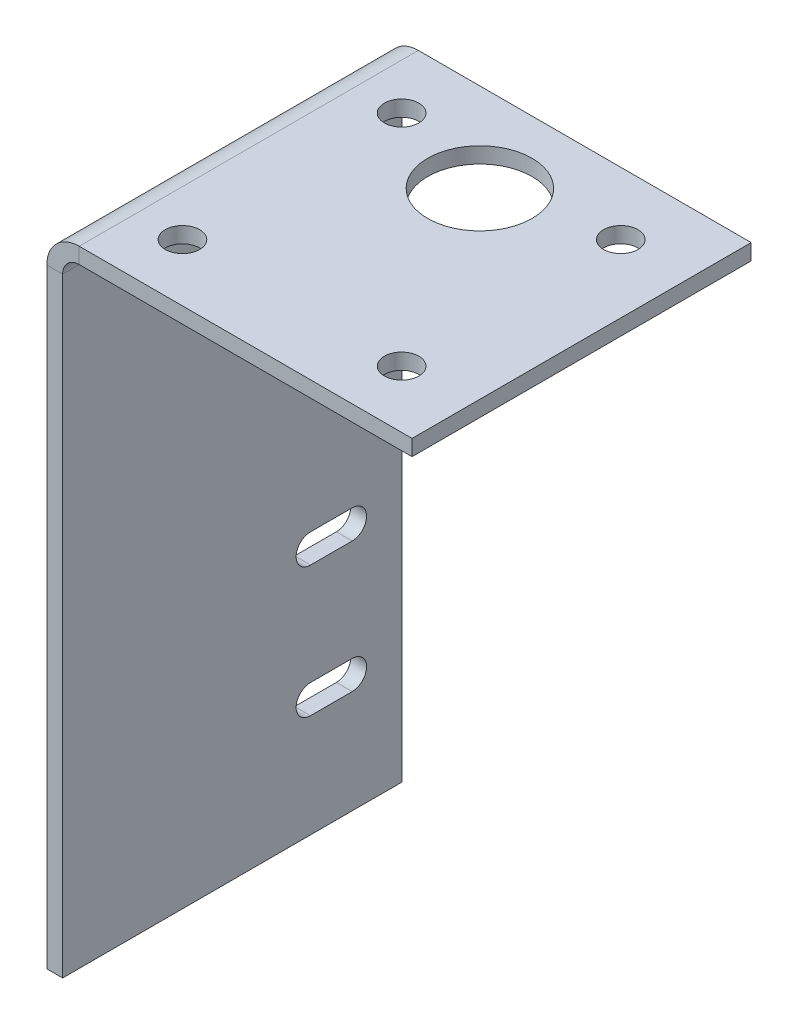
ISO-10303-21;
HEADER;
FILE_DESCRIPTION(('STEP AP214'),'2;1');
FILE_NAME('part.step','',(''),(''),'','','');
FILE_SCHEMA(('AUTOMOTIVE_DESIGN { 1 0 10303 214 1 1 1 1 }'));
ENDSEC;
DATA;
#1=APPLICATION_CONTEXT('core data for automotive mechanical design processes');
#2=APPLICATION_PROTOCOL_DEFINITION('international standard','automotive_design',2000,#1);
#3=PRODUCT_CONTEXT('',#1,'mechanical');
#4=PRODUCT('Part','Part','',(#3));
#5=PRODUCT_RELATED_PRODUCT_CATEGORY('part','',(#4));
#6=PRODUCT_DEFINITION_FORMATION('','',#4);
#7=PRODUCT_DEFINITION_CONTEXT('part definition',#1,'design');
#8=PRODUCT_DEFINITION('design','',#6,#7);
#9=PRODUCT_DEFINITION_SHAPE('','',#8);
#10=(LENGTH_UNIT() NAMED_UNIT(*) SI_UNIT(.MILLI.,.METRE.));
#11=(NAMED_UNIT(*) PLANE_ANGLE_UNIT() SI_UNIT($,.RADIAN.));
#12=(NAMED_UNIT(*) SI_UNIT($,.STERADIAN.) SOLID_ANGLE_UNIT());
#13=UNCERTAINTY_MEASURE_WITH_UNIT(LENGTH_MEASURE(1.E-05),#10,'distance_accuracy_value','');
#14=(GEOMETRIC_REPRESENTATION_CONTEXT(3) GLOBAL_UNCERTAINTY_ASSIGNED_CONTEXT((#13)) GLOBAL_UNIT_ASSIGNED_CONTEXT((#10,
#11,#12)) REPRESENTATION_CONTEXT('',''));
#15=CARTESIAN_POINT('',(0.,0.,0.));
#16=DIRECTION('',(0.,0.,1.));
#17=DIRECTION('',(1.,0.,0.));
#18=AXIS2_PLACEMENT_3D('',#15,#16,#17);
#19=CARTESIAN_POINT('',(0.,-3.03784,-32.5));
#20=DIRECTION('',(0.,0.,-1.));
#21=DIRECTION('',(-1.,0.,0.));
#22=AXIS2_PLACEMENT_3D('',#19,#20,#21);
#23=PLANE('',#22);
#24=DIRECTION('',(-1.,0.,0.));
#25=VECTOR('',#24,1.);
#26=CARTESIAN_POINT('',(0.,-3.03784,-32.5));
#27=LINE('',#26,#25);
#28=CARTESIAN_POINT('',(70.,-3.03784,-32.5));
#29=VERTEX_POINT('',#28);
#30=CARTESIAN_POINT('',(6.21283999999999,-3.03784,-32.5));
#31=VERTEX_POINT('',#30);
#32=EDGE_CURVE('E278',#29,#31,#27,.T.);
#33=ORIENTED_EDGE('',*,*,#32,.T.);
#34=DIRECTION('',(0.,1.,0.));
#35=VECTOR('',#34,1.);
#36=CARTESIAN_POINT('',(6.21283999999999,-3.03784,-32.5));
#37=LINE('',#36,#35);
#38=CARTESIAN_POINT('',(6.21284,0.,-32.5));
#39=VERTEX_POINT('',#38);
#40=EDGE_CURVE('E256',#31,#39,#37,.T.);
#41=ORIENTED_EDGE('',*,*,#40,.T.);
#42=DIRECTION('',(-1.,0.,0.));
#43=VECTOR('',#42,1.);
#44=CARTESIAN_POINT('',(0.,0.,-32.5));
#45=LINE('',#44,#43);
#46=CARTESIAN_POINT('',(70.,0.,-32.5));
#47=VERTEX_POINT('',#46);
#48=EDGE_CURVE('E275',#47,#39,#45,.T.);
#49=ORIENTED_EDGE('',*,*,#48,.F.);
#50=DIRECTION('',(0.,1.,0.));
#51=VECTOR('',#50,1.);
#52=CARTESIAN_POINT('',(70.,-3.03784,-32.5));
#53=LINE('',#52,#51);
#54=EDGE_CURVE('E288',#29,#47,#53,.T.);
#55=ORIENTED_EDGE('',*,*,#54,.F.);
#56=EDGE_LOOP('',(#33,#41,#49,#55));
#57=FACE_BOUND('',#56,.T.);
#58=ADVANCED_FACE('F58',(#57),#23,.T.);
#59=CARTESIAN_POINT('',(0.,-3.03784,0.));
#60=DIRECTION('',(0.,1.,0.));
#61=DIRECTION('',(0.,0.,1.));
#62=AXIS2_PLACEMENT_3D('',#59,#60,#61);
#63=PLANE('',#62);
#64=CARTESIAN_POINT('',(35.,-3.03784,-15.5));
#65=DIRECTION('',(0.,-1.,0.));
#66=DIRECTION('',(0.,0.,-1.));
#67=AXIS2_PLACEMENT_3D('',#64,#65,#66);
#68=CIRCLE('',#67,10.);
#69=CARTESIAN_POINT('',(35.,-3.03784,-25.5));
#70=VERTEX_POINT('',#69);
#71=EDGE_CURVE('E338',#70,#70,#68,.T.);
#72=ORIENTED_EDGE('',*,*,#71,.F.);
#73=EDGE_LOOP('',(#72));
#74=FACE_BOUND('',#73,.T.);
#75=CARTESIAN_POINT('',(57.,-3.03784,-20.5));
#76=DIRECTION('',(0.,1.,0.));
#77=DIRECTION('',(0.,0.,1.));
#78=AXIS2_PLACEMENT_3D('',#75,#76,#77);
#79=CIRCLE('',#78,3.29999999999998);
#80=CARTESIAN_POINT('',(57.,-3.03784,-17.2));
#81=VERTEX_POINT('',#80);
#82=EDGE_CURVE('E331',#81,#81,#79,.T.);
#83=ORIENTED_EDGE('',*,*,#82,.T.);
#84=EDGE_LOOP('',(#83));
#85=FACE_BOUND('',#84,.T.);
#86=CARTESIAN_POINT('',(57.,-3.03784,21.5));
#87=DIRECTION('',(0.,1.,0.));
#88=DIRECTION('',(0.,0.,1.));
#89=AXIS2_PLACEMENT_3D('',#86,#87,#88);
#90=CIRCLE('',#89,3.29999999999998);
#91=CARTESIAN_POINT('',(57.,-3.03784,24.8));
#92=VERTEX_POINT('',#91);
#93=EDGE_CURVE('E325',#92,#92,#90,.T.);
#94=ORIENTED_EDGE('',*,*,#93,.T.);
#95=EDGE_LOOP('',(#94));
#96=FACE_BOUND('',#95,.T.);
#97=CARTESIAN_POINT('',(15.,-3.03784,21.5));
#98=DIRECTION('',(0.,1.,0.));
#99=DIRECTION('',(0.,0.,1.));
#100=AXIS2_PLACEMENT_3D('',#97,#98,#99);
#101=CIRCLE('',#100,3.29999999999998);
#102=CARTESIAN_POINT('',(15.,-3.03784,24.8));
#103=VERTEX_POINT('',#102);
#104=EDGE_CURVE('E319',#103,#103,#101,.T.);
#105=ORIENTED_EDGE('',*,*,#104,.T.);
#106=EDGE_LOOP('',(#105));
#107=FACE_BOUND('',#106,.T.);
#108=CARTESIAN_POINT('',(15.,-3.03784,-20.5));
#109=DIRECTION('',(0.,1.,0.));
#110=DIRECTION('',(0.,0.,1.));
#111=AXIS2_PLACEMENT_3D('',#108,#109,#110);
#112=CIRCLE('',#111,3.29999999999998);
#113=CARTESIAN_POINT('',(15.,-3.03784,-17.2));
#114=VERTEX_POINT('',#113);
#115=EDGE_CURVE('E312',#114,#114,#112,.T.);
#116=ORIENTED_EDGE('',*,*,#115,.T.);
#117=EDGE_LOOP('',(#116));
#118=FACE_BOUND('',#117,.T.);
#119=DIRECTION('',(0.,0.,-1.));
#120=VECTOR('',#119,1.);
#121=CARTESIAN_POINT('',(6.21283999999999,-3.03784,-32.5));
#122=LINE('',#121,#120);
#123=CARTESIAN_POINT('',(6.21283999999999,-3.03784,32.5));
#124=VERTEX_POINT('',#123);
#125=EDGE_CURVE('E262',#31,#124,#122,.F.);
#126=ORIENTED_EDGE('',*,*,#125,.F.);
#127=ORIENTED_EDGE('',*,*,#32,.F.);
#128=DIRECTION('',(0.,0.,-1.));
#129=VECTOR('',#128,1.);
#130=CARTESIAN_POINT('',(70.,-3.03784,-32.5));
#131=LINE('',#130,#129);
#132=CARTESIAN_POINT('',(70.,-3.03784,32.5));
#133=VERTEX_POINT('',#132);
#134=EDGE_CURVE('E274',#133,#29,#131,.T.);
#135=ORIENTED_EDGE('',*,*,#134,.F.);
#136=DIRECTION('',(1.,0.,0.));
#137=VECTOR('',#136,1.);
#138=CARTESIAN_POINT('',(0.,-3.03784,32.5));
#139=LINE('',#138,#137);
#140=EDGE_CURVE('E272',#124,#133,#139,.T.);
#141=ORIENTED_EDGE('',*,*,#140,.F.);
#142=EDGE_LOOP('',(#126,#127,#135,#141));
#143=FACE_BOUND('',#142,.T.);
#144=ADVANCED_FACE('F354',(#74,#85,#96,#107,#118,#143),#63,.F.);
#145=CARTESIAN_POINT('',(0.,0.,0.));
#146=DIRECTION('',(0.,1.,0.));
#147=DIRECTION('',(0.,0.,1.));
#148=AXIS2_PLACEMENT_3D('',#145,#146,#147);
#149=PLANE('',#148);
#150=CARTESIAN_POINT('',(35.,0.,-15.5));
#151=DIRECTION('',(0.,-1.,0.));
#152=DIRECTION('',(0.,0.,-1.));
#153=AXIS2_PLACEMENT_3D('',#150,#151,#152);
#154=CIRCLE('',#153,10.);
#155=CARTESIAN_POINT('',(35.,0.,-25.5));
#156=VERTEX_POINT('',#155);
#157=EDGE_CURVE('E337',#156,#156,#154,.T.);
#158=ORIENTED_EDGE('',*,*,#157,.T.);
#159=EDGE_LOOP('',(#158));
#160=FACE_BOUND('',#159,.T.);
#161=CARTESIAN_POINT('',(57.,0.,-20.5));
#162=DIRECTION('',(0.,1.,0.));
#163=DIRECTION('',(0.,0.,1.));
#164=AXIS2_PLACEMENT_3D('',#161,#162,#163);
#165=CIRCLE('',#164,3.29999999999998);
#166=CARTESIAN_POINT('',(57.,0.,-17.2));
#167=VERTEX_POINT('',#166);
#168=EDGE_CURVE('E334',#167,#167,#165,.T.);
#169=ORIENTED_EDGE('',*,*,#168,.F.);
#170=EDGE_LOOP('',(#169));
#171=FACE_BOUND('',#170,.T.);
#172=CARTESIAN_POINT('',(57.,0.,21.5));
#173=DIRECTION('',(0.,1.,0.));
#174=DIRECTION('',(0.,0.,1.));
#175=AXIS2_PLACEMENT_3D('',#172,#173,#174);
#176=CIRCLE('',#175,3.29999999999999);
#177=CARTESIAN_POINT('',(57.,0.,24.8));
#178=VERTEX_POINT('',#177);
#179=EDGE_CURVE('E328',#178,#178,#176,.T.);
#180=ORIENTED_EDGE('',*,*,#179,.F.);
#181=EDGE_LOOP('',(#180));
#182=FACE_BOUND('',#181,.T.);
#183=CARTESIAN_POINT('',(15.,0.,21.5));
#184=DIRECTION('',(0.,1.,0.));
#185=DIRECTION('',(0.,0.,1.));
#186=AXIS2_PLACEMENT_3D('',#183,#184,#185);
#187=CIRCLE('',#186,3.29999999999999);
#188=CARTESIAN_POINT('',(15.,0.,24.8));
#189=VERTEX_POINT('',#188);
#190=EDGE_CURVE('E322',#189,#189,#187,.T.);
#191=ORIENTED_EDGE('',*,*,#190,.F.);
#192=EDGE_LOOP('',(#191));
#193=FACE_BOUND('',#192,.T.);
#194=CARTESIAN_POINT('',(15.,0.,-20.5));
#195=DIRECTION('',(0.,1.,0.));
#196=DIRECTION('',(0.,0.,1.));
#197=AXIS2_PLACEMENT_3D('',#194,#195,#196);
#198=CIRCLE('',#197,3.29999999999999);
#199=CARTESIAN_POINT('',(15.,0.,-17.2));
#200=VERTEX_POINT('',#199);
#201=EDGE_CURVE('E314',#200,#200,#198,.T.);
#202=ORIENTED_EDGE('',*,*,#201,.F.);
#203=EDGE_LOOP('',(#202));
#204=FACE_BOUND('',#203,.T.);
#205=ORIENTED_EDGE('',*,*,#48,.T.);
#206=DIRECTION('',(0.,0.,-1.));
#207=VECTOR('',#206,1.);
#208=CARTESIAN_POINT('',(6.21284,0.,-32.5));
#209=LINE('',#208,#207);
#210=CARTESIAN_POINT('',(6.21283999999999,0.,32.5));
#211=VERTEX_POINT('',#210);
#212=EDGE_CURVE('E249',#39,#211,#209,.F.);
#213=ORIENTED_EDGE('',*,*,#212,.T.);
#214=DIRECTION('',(1.,0.,0.));
#215=VECTOR('',#214,1.);
#216=CARTESIAN_POINT('',(0.,0.,32.5));
#217=LINE('',#216,#215);
#218=CARTESIAN_POINT('',(70.,0.,32.5));
#219=VERTEX_POINT('',#218);
#220=EDGE_CURVE('E269',#211,#219,#217,.T.);
#221=ORIENTED_EDGE('',*,*,#220,.T.);
#222=DIRECTION('',(0.,0.,-1.));
#223=VECTOR('',#222,1.);
#224=CARTESIAN_POINT('',(70.,0.,-32.5));
#225=LINE('',#224,#223);
#226=EDGE_CURVE('E283',#219,#47,#225,.T.);
#227=ORIENTED_EDGE('',*,*,#226,.T.);
#228=EDGE_LOOP('',(#205,#213,#221,#227));
#229=FACE_BOUND('',#228,.T.);
#230=ADVANCED_FACE('F344',(#160,#171,#182,#193,#204,#229),#149,.T.);
#231=CARTESIAN_POINT('',(70.,-3.03784,-32.5));
#232=DIRECTION('',(1.,0.,0.));
#233=DIRECTION('',(0.,0.,-1.));
#234=AXIS2_PLACEMENT_3D('',#231,#232,#233);
#235=PLANE('',#234);
#236=ORIENTED_EDGE('',*,*,#226,.F.);
#237=DIRECTION('',(0.,1.,0.));
#238=VECTOR('',#237,1.);
#239=CARTESIAN_POINT('',(70.,-3.03784,32.5));
#240=LINE('',#239,#238);
#241=EDGE_CURVE('E281',#133,#219,#240,.T.);
#242=ORIENTED_EDGE('',*,*,#241,.F.);
#243=ORIENTED_EDGE('',*,*,#134,.T.);
#244=ORIENTED_EDGE('',*,*,#54,.T.);
#245=EDGE_LOOP('',(#236,#242,#243,#244));
#246=FACE_BOUND('',#245,.T.);
#247=ADVANCED_FACE('F377',(#246),#235,.T.);
#248=CARTESIAN_POINT('',(0.,-3.03784,32.5));
#249=DIRECTION('',(0.,0.,1.));
#250=DIRECTION('',(1.,0.,0.));
#251=AXIS2_PLACEMENT_3D('',#248,#249,#250);
#252=PLANE('',#251);
#253=DIRECTION('',(0.,1.,0.));
#254=VECTOR('',#253,1.);
#255=CARTESIAN_POINT('',(6.21283999999999,-3.03784,32.5));
#256=LINE('',#255,#254);
#257=EDGE_CURVE('E266',#124,#211,#256,.T.);
#258=ORIENTED_EDGE('',*,*,#257,.F.);
#259=ORIENTED_EDGE('',*,*,#140,.T.);
#260=ORIENTED_EDGE('',*,*,#241,.T.);
#261=ORIENTED_EDGE('',*,*,#220,.F.);
#262=EDGE_LOOP('',(#258,#259,#260,#261));
#263=FACE_BOUND('',#262,.T.);
#264=ADVANCED_FACE('F60',(#263),#252,.T.);
#265=CARTESIAN_POINT('',(6.21283999999999,-6.21284,32.5));
#266=DIRECTION('',(0.,0.,1.));
#267=DIRECTION('',(1.,0.,0.));
#268=AXIS2_PLACEMENT_3D('',#265,#266,#267);
#269=PLANE('',#268);
#270=DIRECTION('',(1.,0.,0.));
#271=VECTOR('',#270,1.);
#272=CARTESIAN_POINT('',(0.,-6.21283999999998,32.5));
#273=LINE('',#272,#271);
#274=CARTESIAN_POINT('',(3.03783999999999,-6.21283999999999,32.5));
#275=VERTEX_POINT('',#274);
#276=CARTESIAN_POINT('',(0.,-6.21283999999998,32.4999999999999));
#277=VERTEX_POINT('',#276);
#278=EDGE_CURVE('E212',#275,#277,#273,.F.);
#279=ORIENTED_EDGE('',*,*,#278,.F.);
#280=CARTESIAN_POINT('',(6.21283999999999,-6.21284,32.5));
#281=DIRECTION('',(0.,0.,-1.));
#282=DIRECTION('',(-1.,0.,0.));
#283=AXIS2_PLACEMENT_3D('',#280,#281,#282);
#284=CIRCLE('',#283,3.175);
#285=EDGE_CURVE('E259',#124,#275,#284,.F.);
#286=ORIENTED_EDGE('',*,*,#285,.F.);
#287=ORIENTED_EDGE('',*,*,#257,.T.);
#288=CARTESIAN_POINT('',(6.21283999999999,-6.21284,32.4999999999999));
#289=DIRECTION('',(0.,0.,-1.));
#290=DIRECTION('',(-1.,0.,0.));
#291=AXIS2_PLACEMENT_3D('',#288,#289,#290);
#292=CIRCLE('',#291,6.21284);
#293=EDGE_CURVE('E252',#211,#277,#292,.F.);
#294=ORIENTED_EDGE('',*,*,#293,.T.);
#295=EDGE_LOOP('',(#279,#286,#287,#294));
#296=FACE_BOUND('',#295,.T.);
#297=ADVANCED_FACE('F382',(#296),#269,.T.);
#298=CARTESIAN_POINT('',(6.21283999999999,-6.21284,-32.5));
#299=DIRECTION('',(0.,0.,1.));
#300=DIRECTION('',(1.,0.,0.));
#301=AXIS2_PLACEMENT_3D('',#298,#299,#300);
#302=PLANE('',#301);
#303=CARTESIAN_POINT('',(6.21283999999999,-6.21284,-32.5));
#304=DIRECTION('',(0.,0.,-1.));
#305=DIRECTION('',(-1.,0.,0.));
#306=AXIS2_PLACEMENT_3D('',#303,#304,#305);
#307=CIRCLE('',#306,3.175);
#308=CARTESIAN_POINT('',(3.03783999999999,-6.21283999999999,-32.5));
#309=VERTEX_POINT('',#308);
#310=EDGE_CURVE('E222',#309,#31,#307,.T.);
#311=ORIENTED_EDGE('',*,*,#310,.F.);
#312=DIRECTION('',(1.,0.,0.));
#313=VECTOR('',#312,1.);
#314=CARTESIAN_POINT('',(3.03783999999999,-6.21283999999999,-32.5));
#315=LINE('',#314,#313);
#316=CARTESIAN_POINT('',(0.,-6.21283999999998,-32.5));
#317=VERTEX_POINT('',#316);
#318=EDGE_CURVE('E242',#309,#317,#315,.F.);
#319=ORIENTED_EDGE('',*,*,#318,.T.);
#320=CARTESIAN_POINT('',(6.21283999999999,-6.21284,-32.5));
#321=DIRECTION('',(0.,0.,-1.));
#322=DIRECTION('',(-1.,0.,0.));
#323=AXIS2_PLACEMENT_3D('',#320,#321,#322);
#324=CIRCLE('',#323,6.21284);
#325=EDGE_CURVE('E253',#317,#39,#324,.T.);
#326=ORIENTED_EDGE('',*,*,#325,.T.);
#327=ORIENTED_EDGE('',*,*,#40,.F.);
#328=EDGE_LOOP('',(#311,#319,#326,#327));
#329=FACE_BOUND('',#328,.T.);
#330=ADVANCED_FACE('F388',(#329),#302,.F.);
#331=CARTESIAN_POINT('',(6.21283999999999,-6.21284,-32.5));
#332=DIRECTION('',(0.,0.,-1.));
#333=DIRECTION('',(-1.,0.,0.));
#334=AXIS2_PLACEMENT_3D('',#331,#332,#333);
#335=CYLINDRICAL_SURFACE('',#334,6.21284);
#336=ORIENTED_EDGE('',*,*,#212,.F.);
#337=ORIENTED_EDGE('',*,*,#325,.F.);
#338=DIRECTION('',(0.,0.,-1.));
#339=VECTOR('',#338,1.);
#340=CARTESIAN_POINT('',(0.,-6.21283999999998,32.5));
#341=LINE('',#340,#339);
#342=EDGE_CURVE('E240',#317,#277,#341,.F.);
#343=ORIENTED_EDGE('',*,*,#342,.T.);
#344=ORIENTED_EDGE('',*,*,#293,.F.);
#345=EDGE_LOOP('',(#336,#337,#343,#344));
#346=FACE_BOUND('',#345,.T.);
#347=ADVANCED_FACE('F385',(#346),#335,.T.);
#348=CARTESIAN_POINT('',(6.21283999999999,-6.21284,-32.5));
#349=DIRECTION('',(0.,0.,-1.));
#350=DIRECTION('',(-1.,0.,0.));
#351=AXIS2_PLACEMENT_3D('',#348,#349,#350);
#352=CYLINDRICAL_SURFACE('',#351,3.175);
#353=ORIENTED_EDGE('',*,*,#125,.T.);
#354=ORIENTED_EDGE('',*,*,#285,.T.);
#355=DIRECTION('',(0.,0.,-1.));
#356=VECTOR('',#355,1.);
#357=CARTESIAN_POINT('',(3.03783999999999,-6.21283999999999,32.5));
#358=LINE('',#357,#356);
#359=EDGE_CURVE('E245',#275,#309,#358,.T.);
#360=ORIENTED_EDGE('',*,*,#359,.T.);
#361=ORIENTED_EDGE('',*,*,#310,.T.);
#362=EDGE_LOOP('',(#353,#354,#360,#361));
#363=FACE_BOUND('',#362,.T.);
#364=ADVANCED_FACE('F407',(#363),#352,.F.);
#365=CARTESIAN_POINT('',(-4.13297868151474E-13,-123.03784,-32.5));
#366=DIRECTION('',(0.,0.,1.));
#367=DIRECTION('',(1.,0.,0.));
#368=AXIS2_PLACEMENT_3D('',#365,#366,#367);
#369=PLANE('',#368);
#370=ORIENTED_EDGE('',*,*,#318,.F.);
#371=DIRECTION('',(0.,1.,0.));
#372=VECTOR('',#371,1.);
#373=CARTESIAN_POINT('',(3.03783999999959,-123.03784,-32.5));
#374=LINE('',#373,#372);
#375=CARTESIAN_POINT('',(3.03783999999959,-123.03784,-32.5));
#376=VERTEX_POINT('',#375);
#377=EDGE_CURVE('E238',#309,#376,#374,.F.);
#378=ORIENTED_EDGE('',*,*,#377,.T.);
#379=DIRECTION('',(1.,0.,0.));
#380=VECTOR('',#379,1.);
#381=CARTESIAN_POINT('',(-4.13297868151474E-13,-123.03784,-32.5));
#382=LINE('',#381,#380);
#383=CARTESIAN_POINT('',(-4.13538130178782E-13,-123.03784,-32.5));
#384=VERTEX_POINT('',#383);
#385=EDGE_CURVE('E219',#384,#376,#382,.T.);
#386=ORIENTED_EDGE('',*,*,#385,.F.);
#387=DIRECTION('',(0.,-1.,0.));
#388=VECTOR('',#387,1.);
#389=CARTESIAN_POINT('',(0.,0.,-32.5));
#390=LINE('',#389,#388);
#391=EDGE_CURVE('E231',#317,#384,#390,.T.);
#392=ORIENTED_EDGE('',*,*,#391,.F.);
#393=EDGE_LOOP('',(#370,#378,#386,#392));
#394=FACE_BOUND('',#393,.T.);
#395=ADVANCED_FACE('F398',(#394),#369,.F.);
#396=CARTESIAN_POINT('',(0.,-3.03783999999999,32.5));
#397=DIRECTION('',(0.,0.,-1.));
#398=DIRECTION('',(-1.,0.,0.));
#399=AXIS2_PLACEMENT_3D('',#396,#397,#398);
#400=PLANE('',#399);
#401=ORIENTED_EDGE('',*,*,#278,.T.);
#402=DIRECTION('',(0.,1.,0.));
#403=VECTOR('',#402,1.);
#404=CARTESIAN_POINT('',(0.,0.,32.5));
#405=LINE('',#404,#403);
#406=CARTESIAN_POINT('',(-4.13538130178782E-13,-123.03784,32.5));
#407=VERTEX_POINT('',#406);
#408=EDGE_CURVE('E226',#407,#277,#405,.T.);
#409=ORIENTED_EDGE('',*,*,#408,.F.);
#410=DIRECTION('',(1.,0.,0.));
#411=VECTOR('',#410,1.);
#412=CARTESIAN_POINT('',(-4.13339909364251E-13,-123.03784,32.5));
#413=LINE('',#412,#411);
#414=CARTESIAN_POINT('',(3.03783999999959,-123.03784,32.5));
#415=VERTEX_POINT('',#414);
#416=EDGE_CURVE('E223',#407,#415,#413,.T.);
#417=ORIENTED_EDGE('',*,*,#416,.T.);
#418=DIRECTION('',(0.,-1.,0.));
#419=VECTOR('',#418,1.);
#420=CARTESIAN_POINT('',(3.03784000000001,-3.03784,32.5));
#421=LINE('',#420,#419);
#422=EDGE_CURVE('E233',#415,#275,#421,.F.);
#423=ORIENTED_EDGE('',*,*,#422,.T.);
#424=EDGE_LOOP('',(#401,#409,#417,#423));
#425=FACE_BOUND('',#424,.T.);
#426=ADVANCED_FACE('F405',(#425),#400,.F.);
#427=CARTESIAN_POINT('',(0.,0.,0.));
#428=DIRECTION('',(1.,0.,0.));
#429=DIRECTION('',(0.,1.,0.));
#430=AXIS2_PLACEMENT_3D('',#427,#428,#429);
#431=PLANE('',#430);
#432=DIRECTION('',(0.,0.,1.));
#433=VECTOR('',#432,1.);
#434=CARTESIAN_POINT('',(-3.60495448235553E-13,-103.25,-23.));
#435=LINE('',#434,#433);
#436=CARTESIAN_POINT('',(-3.44449256082768E-13,-103.25,-23.));
#437=VERTEX_POINT('',#436);
#438=CARTESIAN_POINT('',(-3.60495448235553E-13,-103.25,-15.));
#439=VERTEX_POINT('',#438);
#440=EDGE_CURVE('E182',#437,#439,#435,.T.);
#441=ORIENTED_EDGE('',*,*,#440,.F.);
#442=CARTESIAN_POINT('',(-3.50893874553735E-13,-100.5,-23.));
#443=DIRECTION('',(-1.,0.,0.));
#444=DIRECTION('',(0.,-1.,0.));
#445=AXIS2_PLACEMENT_3D('',#442,#443,#444);
#446=CIRCLE('',#445,2.74999999999999);
#447=CARTESIAN_POINT('',(-3.41292300871916E-13,-97.75,-23.));
#448=VERTEX_POINT('',#447);
#449=EDGE_CURVE('E73',#448,#437,#446,.T.);
#450=ORIENTED_EDGE('',*,*,#449,.F.);
#451=DIRECTION('',(0.,0.,-1.));
#452=VECTOR('',#451,1.);
#453=CARTESIAN_POINT('',(-3.41292300871916E-13,-97.75,-23.));
#454=LINE('',#453,#452);
#455=CARTESIAN_POINT('',(-3.41292300871916E-13,-97.75,-15.));
#456=VERTEX_POINT('',#455);
#457=EDGE_CURVE('E189',#456,#448,#454,.T.);
#458=ORIENTED_EDGE('',*,*,#457,.F.);
#459=CARTESIAN_POINT('',(-3.50893874553735E-13,-100.5,-15.));
#460=DIRECTION('',(-1.,0.,0.));
#461=DIRECTION('',(0.,-1.,0.));
#462=AXIS2_PLACEMENT_3D('',#459,#460,#461);
#463=CIRCLE('',#462,2.74999999999999);
#464=EDGE_CURVE('E173',#439,#456,#463,.T.);
#465=ORIENTED_EDGE('',*,*,#464,.F.);
#466=EDGE_LOOP('',(#441,#450,#458,#465));
#467=FACE_BOUND('',#466,.T.);
#468=DIRECTION('',(0.,0.,1.));
#469=VECTOR('',#468,1.);
#470=CARTESIAN_POINT('',(-2.73208414764475E-13,-78.25,-23.));
#471=LINE('',#470,#469);
#472=CARTESIAN_POINT('',(-2.5716222261169E-13,-78.25,-23.));
#473=VERTEX_POINT('',#472);
#474=CARTESIAN_POINT('',(-2.73208414764475E-13,-78.25,-15.));
#475=VERTEX_POINT('',#474);
#476=EDGE_CURVE('E200',#473,#475,#471,.T.);
#477=ORIENTED_EDGE('',*,*,#476,.F.);
#478=CARTESIAN_POINT('',(-2.63606841082656E-13,-75.5,-23.));
#479=DIRECTION('',(-1.,0.,0.));
#480=DIRECTION('',(0.,-1.,0.));
#481=AXIS2_PLACEMENT_3D('',#478,#479,#480);
#482=CIRCLE('',#481,2.75);
#483=CARTESIAN_POINT('',(-2.54005267400838E-13,-72.75,-23.));
#484=VERTEX_POINT('',#483);
#485=EDGE_CURVE('E196',#484,#473,#482,.T.);
#486=ORIENTED_EDGE('',*,*,#485,.F.);
#487=DIRECTION('',(0.,0.,-1.));
#488=VECTOR('',#487,1.);
#489=CARTESIAN_POINT('',(-2.54005267400838E-13,-72.75,-23.));
#490=LINE('',#489,#488);
#491=CARTESIAN_POINT('',(-2.54005267400838E-13,-72.75,-15.));
#492=VERTEX_POINT('',#491);
#493=EDGE_CURVE('E206',#492,#484,#490,.T.);
#494=ORIENTED_EDGE('',*,*,#493,.F.);
#495=CARTESIAN_POINT('',(-2.63606841082656E-13,-75.5,-15.));
#496=DIRECTION('',(-1.,0.,0.));
#497=DIRECTION('',(0.,-1.,0.));
#498=AXIS2_PLACEMENT_3D('',#495,#496,#497);
#499=CIRCLE('',#498,2.75);
#500=EDGE_CURVE('E203',#475,#492,#499,.T.);
#501=ORIENTED_EDGE('',*,*,#500,.F.);
#502=EDGE_LOOP('',(#477,#486,#494,#501));
#503=FACE_BOUND('',#502,.T.);
#504=ORIENTED_EDGE('',*,*,#342,.F.);
#505=ORIENTED_EDGE('',*,*,#391,.T.);
#506=DIRECTION('',(0.,0.,1.));
#507=VECTOR('',#506,1.);
#508=CARTESIAN_POINT('',(-4.13538130178782E-13,-123.03784,0.));
#509=LINE('',#508,#507);
#510=EDGE_CURVE('E229',#384,#407,#509,.T.);
#511=ORIENTED_EDGE('',*,*,#510,.T.);
#512=ORIENTED_EDGE('',*,*,#408,.T.);
#513=EDGE_LOOP('',(#504,#505,#511,#512));
#514=FACE_BOUND('',#513,.T.);
#515=ADVANCED_FACE('F186',(#467,#503,#514),#431,.F.);
#516=CARTESIAN_POINT('',(3.03784000000002,0.,0.));
#517=DIRECTION('',(1.,0.,0.));
#518=DIRECTION('',(0.,1.,0.));
#519=AXIS2_PLACEMENT_3D('',#516,#517,#518);
#520=PLANE('',#519);
#521=CARTESIAN_POINT('',(3.03783999999967,-100.5,-23.));
#522=DIRECTION('',(1.,0.,0.));
#523=DIRECTION('',(0.,1.,0.));
#524=AXIS2_PLACEMENT_3D('',#521,#522,#523);
#525=CIRCLE('',#524,2.74999999999999);
#526=CARTESIAN_POINT('',(3.03783999999965,-103.25,-23.));
#527=VERTEX_POINT('',#526);
#528=CARTESIAN_POINT('',(3.03783999999968,-97.75,-23.));
#529=VERTEX_POINT('',#528);
#530=EDGE_CURVE('E13',#527,#529,#525,.T.);
#531=ORIENTED_EDGE('',*,*,#530,.F.);
#532=DIRECTION('',(0.,0.,-1.));
#533=VECTOR('',#532,1.);
#534=CARTESIAN_POINT('',(3.03783999999966,-103.25,0.));
#535=LINE('',#534,#533);
#536=CARTESIAN_POINT('',(3.03783999999966,-103.25,-15.));
#537=VERTEX_POINT('',#536);
#538=EDGE_CURVE('E301',#537,#527,#535,.T.);
#539=ORIENTED_EDGE('',*,*,#538,.F.);
#540=CARTESIAN_POINT('',(3.03783999999967,-100.5,-15.));
#541=DIRECTION('',(1.,0.,0.));
#542=DIRECTION('',(0.,1.,0.));
#543=AXIS2_PLACEMENT_3D('',#540,#541,#542);
#544=CIRCLE('',#543,2.74999999999999);
#545=CARTESIAN_POINT('',(3.03783999999968,-97.75,-15.));
#546=VERTEX_POINT('',#545);
#547=EDGE_CURVE('E176',#546,#537,#544,.T.);
#548=ORIENTED_EDGE('',*,*,#547,.F.);
#549=DIRECTION('',(0.,0.,1.));
#550=VECTOR('',#549,1.);
#551=CARTESIAN_POINT('',(3.03783999999967,-97.75,0.));
#552=LINE('',#551,#550);
#553=EDGE_CURVE('E66',#529,#546,#552,.T.);
#554=ORIENTED_EDGE('',*,*,#553,.F.);
#555=EDGE_LOOP('',(#531,#539,#548,#554));
#556=FACE_BOUND('',#555,.T.);
#557=CARTESIAN_POINT('',(3.03783999999975,-75.5,-23.));
#558=DIRECTION('',(1.,0.,0.));
#559=DIRECTION('',(0.,1.,0.));
#560=AXIS2_PLACEMENT_3D('',#557,#558,#559);
#561=CIRCLE('',#560,2.75);
#562=CARTESIAN_POINT('',(3.03783999999974,-78.25,-23.));
#563=VERTEX_POINT('',#562);
#564=CARTESIAN_POINT('',(3.03783999999976,-72.75,-23.));
#565=VERTEX_POINT('',#564);
#566=EDGE_CURVE('E299',#563,#565,#561,.T.);
#567=ORIENTED_EDGE('',*,*,#566,.F.);
#568=DIRECTION('',(0.,0.,-1.));
#569=VECTOR('',#568,1.);
#570=CARTESIAN_POINT('',(3.03783999999974,-78.25,0.));
#571=LINE('',#570,#569);
#572=CARTESIAN_POINT('',(3.03783999999974,-78.25,-15.));
#573=VERTEX_POINT('',#572);
#574=EDGE_CURVE('E290',#573,#563,#571,.T.);
#575=ORIENTED_EDGE('',*,*,#574,.F.);
#576=CARTESIAN_POINT('',(3.03783999999975,-75.5,-15.));
#577=DIRECTION('',(1.,0.,0.));
#578=DIRECTION('',(0.,1.,0.));
#579=AXIS2_PLACEMENT_3D('',#576,#577,#578);
#580=CIRCLE('',#579,2.75);
#581=CARTESIAN_POINT('',(3.03783999999976,-72.75,-15.));
#582=VERTEX_POINT('',#581);
#583=EDGE_CURVE('E294',#582,#573,#580,.T.);
#584=ORIENTED_EDGE('',*,*,#583,.F.);
#585=DIRECTION('',(0.,0.,1.));
#586=VECTOR('',#585,1.);
#587=CARTESIAN_POINT('',(3.03783999999976,-72.75,0.));
#588=LINE('',#587,#586);
#589=EDGE_CURVE('E297',#565,#582,#588,.T.);
#590=ORIENTED_EDGE('',*,*,#589,.F.);
#591=EDGE_LOOP('',(#567,#575,#584,#590));
#592=FACE_BOUND('',#591,.T.);
#593=ORIENTED_EDGE('',*,*,#377,.F.);
#594=ORIENTED_EDGE('',*,*,#359,.F.);
#595=ORIENTED_EDGE('',*,*,#422,.F.);
#596=DIRECTION('',(0.,0.,-1.));
#597=VECTOR('',#596,1.);
#598=CARTESIAN_POINT('',(3.03783999999959,-123.03784,32.5));
#599=LINE('',#598,#597);
#600=EDGE_CURVE('E236',#376,#415,#599,.F.);
#601=ORIENTED_EDGE('',*,*,#600,.F.);
#602=EDGE_LOOP('',(#593,#594,#595,#601));
#603=FACE_BOUND('',#602,.T.);
#604=ADVANCED_FACE('F309',(#556,#592,#603),#520,.T.);
#605=CARTESIAN_POINT('',(-4.13297868151474E-13,-123.03784,32.5));
#606=DIRECTION('',(0.,1.,0.));
#607=DIRECTION('',(-1.,0.,0.));
#608=AXIS2_PLACEMENT_3D('',#605,#606,#607);
#609=PLANE('',#608);
#610=ORIENTED_EDGE('',*,*,#600,.T.);
#611=ORIENTED_EDGE('',*,*,#416,.F.);
#612=ORIENTED_EDGE('',*,*,#510,.F.);
#613=ORIENTED_EDGE('',*,*,#385,.T.);
#614=EDGE_LOOP('',(#610,#611,#612,#613));
#615=FACE_BOUND('',#614,.T.);
#616=ADVANCED_FACE('F401',(#615),#609,.F.);
#617=CARTESIAN_POINT('',(70.0000000000002,-75.5000000000002,-23.));
#618=DIRECTION('',(-1.,0.,0.));
#619=DIRECTION('',(0.,-1.,0.));
#620=AXIS2_PLACEMENT_3D('',#617,#618,#619);
#621=CYLINDRICAL_SURFACE('',#620,2.75);
#622=ORIENTED_EDGE('',*,*,#566,.T.);
#623=DIRECTION('',(-1.,0.,0.));
#624=VECTOR('',#623,1.);
#625=CARTESIAN_POINT('',(70.0000000000002,-72.7500000000002,-23.));
#626=LINE('',#625,#624);
#627=EDGE_CURVE('E210',#565,#484,#626,.T.);
#628=ORIENTED_EDGE('',*,*,#627,.T.);
#629=ORIENTED_EDGE('',*,*,#485,.T.);
#630=DIRECTION('',(-1.,0.,0.));
#631=VECTOR('',#630,1.);
#632=CARTESIAN_POINT('',(70.0000000000002,-78.2500000000002,-23.));
#633=LINE('',#632,#631);
#634=EDGE_CURVE('E209',#563,#473,#633,.T.);
#635=ORIENTED_EDGE('',*,*,#634,.F.);
#636=EDGE_LOOP('',(#622,#628,#629,#635));
#637=FACE_BOUND('',#636,.T.);
#638=ADVANCED_FACE('F415',(#637),#621,.F.);
#639=CARTESIAN_POINT('',(70.0000000000002,-72.7500000000002,-23.));
#640=DIRECTION('',(0.,1.,0.));
#641=DIRECTION('',(-1.,0.,0.));
#642=AXIS2_PLACEMENT_3D('',#639,#640,#641);
#643=PLANE('',#642);
#644=ORIENTED_EDGE('',*,*,#589,.T.);
#645=DIRECTION('',(-1.,0.,0.));
#646=VECTOR('',#645,1.);
#647=CARTESIAN_POINT('',(70.0000000000002,-72.7500000000002,-15.));
#648=LINE('',#647,#646);
#649=EDGE_CURVE('E213',#582,#492,#648,.T.);
#650=ORIENTED_EDGE('',*,*,#649,.T.);
#651=ORIENTED_EDGE('',*,*,#493,.T.);
#652=ORIENTED_EDGE('',*,*,#627,.F.);
#653=EDGE_LOOP('',(#644,#650,#651,#652));
#654=FACE_BOUND('',#653,.T.);
#655=ADVANCED_FACE('F534',(#654),#643,.F.);
#656=CARTESIAN_POINT('',(70.0000000000002,-75.5000000000002,-15.));
#657=DIRECTION('',(-1.,0.,0.));
#658=DIRECTION('',(0.,-1.,0.));
#659=AXIS2_PLACEMENT_3D('',#656,#657,#658);
#660=CYLINDRICAL_SURFACE('',#659,2.75);
#661=ORIENTED_EDGE('',*,*,#583,.T.);
#662=DIRECTION('',(-1.,0.,0.));
#663=VECTOR('',#662,1.);
#664=CARTESIAN_POINT('',(70.0000000000002,-78.2500000000002,-15.));
#665=LINE('',#664,#663);
#666=EDGE_CURVE('E215',#573,#475,#665,.T.);
#667=ORIENTED_EDGE('',*,*,#666,.T.);
#668=ORIENTED_EDGE('',*,*,#500,.T.);
#669=ORIENTED_EDGE('',*,*,#649,.F.);
#670=EDGE_LOOP('',(#661,#667,#668,#669));
#671=FACE_BOUND('',#670,.T.);
#672=ADVANCED_FACE('F523',(#671),#660,.F.);
#673=CARTESIAN_POINT('',(70.0000000000002,-78.2500000000002,-23.));
#674=DIRECTION('',(0.,-1.,0.));
#675=DIRECTION('',(1.,0.,0.));
#676=AXIS2_PLACEMENT_3D('',#673,#674,#675);
#677=PLANE('',#676);
#678=ORIENTED_EDGE('',*,*,#574,.T.);
#679=ORIENTED_EDGE('',*,*,#634,.T.);
#680=ORIENTED_EDGE('',*,*,#476,.T.);
#681=ORIENTED_EDGE('',*,*,#666,.F.);
#682=EDGE_LOOP('',(#678,#679,#680,#681));
#683=FACE_BOUND('',#682,.T.);
#684=ADVANCED_FACE('F513',(#683),#677,.F.);
#685=CARTESIAN_POINT('',(70.0000000000001,-100.5,-23.));
#686=DIRECTION('',(-1.,0.,0.));
#687=DIRECTION('',(0.,-1.,0.));
#688=AXIS2_PLACEMENT_3D('',#685,#686,#687);
#689=CYLINDRICAL_SURFACE('',#688,2.74999999999999);
#690=ORIENTED_EDGE('',*,*,#530,.T.);
#691=DIRECTION('',(-1.,0.,0.));
#692=VECTOR('',#691,1.);
#693=CARTESIAN_POINT('',(70.0000000000001,-97.7500000000003,-23.));
#694=LINE('',#693,#692);
#695=EDGE_CURVE('E194',#529,#448,#694,.T.);
#696=ORIENTED_EDGE('',*,*,#695,.T.);
#697=ORIENTED_EDGE('',*,*,#449,.T.);
#698=DIRECTION('',(-1.,0.,0.));
#699=VECTOR('',#698,1.);
#700=CARTESIAN_POINT('',(70.0000000000001,-103.25,-23.));
#701=LINE('',#700,#699);
#702=EDGE_CURVE('E179',#527,#437,#701,.T.);
#703=ORIENTED_EDGE('',*,*,#702,.F.);
#704=EDGE_LOOP('',(#690,#696,#697,#703));
#705=FACE_BOUND('',#704,.T.);
#706=ADVANCED_FACE('F311',(#705),#689,.F.);
#707=CARTESIAN_POINT('',(70.0000000000001,-97.7500000000003,-23.));
#708=DIRECTION('',(0.,1.,0.));
#709=DIRECTION('',(-1.,0.,0.));
#710=AXIS2_PLACEMENT_3D('',#707,#708,#709);
#711=PLANE('',#710);
#712=ORIENTED_EDGE('',*,*,#553,.T.);
#713=DIRECTION('',(-1.,0.,0.));
#714=VECTOR('',#713,1.);
#715=CARTESIAN_POINT('',(70.0000000000001,-97.7500000000003,-15.));
#716=LINE('',#715,#714);
#717=EDGE_CURVE('E178',#546,#456,#716,.T.);
#718=ORIENTED_EDGE('',*,*,#717,.T.);
#719=ORIENTED_EDGE('',*,*,#457,.T.);
#720=ORIENTED_EDGE('',*,*,#695,.F.);
#721=EDGE_LOOP('',(#712,#718,#719,#720));
#722=FACE_BOUND('',#721,.T.);
#723=ADVANCED_FACE('F306',(#722),#711,.F.);
#724=CARTESIAN_POINT('',(70.0000000000001,-100.5,-15.));
#725=DIRECTION('',(-1.,0.,0.));
#726=DIRECTION('',(0.,-1.,0.));
#727=AXIS2_PLACEMENT_3D('',#724,#725,#726);
#728=CYLINDRICAL_SURFACE('',#727,2.74999999999999);
#729=ORIENTED_EDGE('',*,*,#547,.T.);
#730=DIRECTION('',(-1.,0.,0.));
#731=VECTOR('',#730,1.);
#732=CARTESIAN_POINT('',(70.0000000000001,-103.25,-15.));
#733=LINE('',#732,#731);
#734=EDGE_CURVE('E81',#537,#439,#733,.T.);
#735=ORIENTED_EDGE('',*,*,#734,.T.);
#736=ORIENTED_EDGE('',*,*,#464,.T.);
#737=ORIENTED_EDGE('',*,*,#717,.F.);
#738=EDGE_LOOP('',(#729,#735,#736,#737));
#739=FACE_BOUND('',#738,.T.);
#740=ADVANCED_FACE('F170',(#739),#728,.F.);
#741=CARTESIAN_POINT('',(70.0000000000001,-103.25,-23.));
#742=DIRECTION('',(0.,-1.,0.));
#743=DIRECTION('',(1.,0.,0.));
#744=AXIS2_PLACEMENT_3D('',#741,#742,#743);
#745=PLANE('',#744);
#746=ORIENTED_EDGE('',*,*,#538,.T.);
#747=ORIENTED_EDGE('',*,*,#702,.T.);
#748=ORIENTED_EDGE('',*,*,#440,.T.);
#749=ORIENTED_EDGE('',*,*,#734,.F.);
#750=EDGE_LOOP('',(#746,#747,#748,#749));
#751=FACE_BOUND('',#750,.T.);
#752=ADVANCED_FACE('F183',(#751),#745,.F.);
#753=CARTESIAN_POINT('',(15.,0.,-20.5));
#754=DIRECTION('',(0.,1.,0.));
#755=DIRECTION('',(0.,0.,1.));
#756=AXIS2_PLACEMENT_3D('',#753,#754,#755);
#757=CYLINDRICAL_SURFACE('',#756,3.29999999999998);
#758=ORIENTED_EDGE('',*,*,#201,.T.);
#759=EDGE_LOOP('',(#758));
#760=FACE_BOUND('',#759,.T.);
#761=ORIENTED_EDGE('',*,*,#115,.F.);
#762=EDGE_LOOP('',(#761));
#763=FACE_BOUND('',#762,.T.);
#764=ADVANCED_FACE('F467',(#760,#763),#757,.F.);
#765=CARTESIAN_POINT('',(15.,0.,21.5));
#766=DIRECTION('',(0.,1.,0.));
#767=DIRECTION('',(0.,0.,1.));
#768=AXIS2_PLACEMENT_3D('',#765,#766,#767);
#769=CYLINDRICAL_SURFACE('',#768,3.29999999999998);
#770=ORIENTED_EDGE('',*,*,#190,.T.);
#771=EDGE_LOOP('',(#770));
#772=FACE_BOUND('',#771,.T.);
#773=ORIENTED_EDGE('',*,*,#104,.F.);
#774=EDGE_LOOP('',(#773));
#775=FACE_BOUND('',#774,.T.);
#776=ADVANCED_FACE('F457',(#772,#775),#769,.F.);
#777=CARTESIAN_POINT('',(57.,0.,21.5));
#778=DIRECTION('',(0.,1.,0.));
#779=DIRECTION('',(0.,0.,1.));
#780=AXIS2_PLACEMENT_3D('',#777,#778,#779);
#781=CYLINDRICAL_SURFACE('',#780,3.29999999999998);
#782=ORIENTED_EDGE('',*,*,#179,.T.);
#783=EDGE_LOOP('',(#782));
#784=FACE_BOUND('',#783,.T.);
#785=ORIENTED_EDGE('',*,*,#93,.F.);
#786=EDGE_LOOP('',(#785));
#787=FACE_BOUND('',#786,.T.);
#788=ADVANCED_FACE('F446',(#784,#787),#781,.F.);
#789=CARTESIAN_POINT('',(57.,0.,-20.5));
#790=DIRECTION('',(0.,1.,0.));
#791=DIRECTION('',(0.,0.,1.));
#792=AXIS2_PLACEMENT_3D('',#789,#790,#791);
#793=CYLINDRICAL_SURFACE('',#792,3.29999999999998);
#794=ORIENTED_EDGE('',*,*,#168,.T.);
#795=EDGE_LOOP('',(#794));
#796=FACE_BOUND('',#795,.T.);
#797=ORIENTED_EDGE('',*,*,#82,.F.);
#798=EDGE_LOOP('',(#797));
#799=FACE_BOUND('',#798,.T.);
#800=ADVANCED_FACE('F350',(#796,#799),#793,.F.);
#801=CARTESIAN_POINT('',(35.,0.,-15.5));
#802=DIRECTION('',(0.,-1.,0.));
#803=DIRECTION('',(0.,0.,-1.));
#804=AXIS2_PLACEMENT_3D('',#801,#802,#803);
#805=CYLINDRICAL_SURFACE('',#804,10.);
#806=ORIENTED_EDGE('',*,*,#157,.F.);
#807=EDGE_LOOP('',(#806));
#808=FACE_BOUND('',#807,.T.);
#809=ORIENTED_EDGE('',*,*,#71,.T.);
#810=EDGE_LOOP('',(#809));
#811=FACE_BOUND('',#810,.T.);
#812=ADVANCED_FACE('F347',(#808,#811),#805,.F.);
#813=CLOSED_SHELL('',(#58,#144,#230,#247,#264,#297,#330,#347,#364,#395,#426,#515,#604,#616,#638,
#655,#672,#684,#706,#723,#740,#752,#764,#776,#788,#800,#812));
#814=MANIFOLD_SOLID_BREP('B2',#813);
#815=ADVANCED_BREP_SHAPE_REPRESENTATION('',(#18,#814),#14);
#816=SHAPE_DEFINITION_REPRESENTATION(#9,#815);
ENDSEC;
END-ISO-10303-21;
